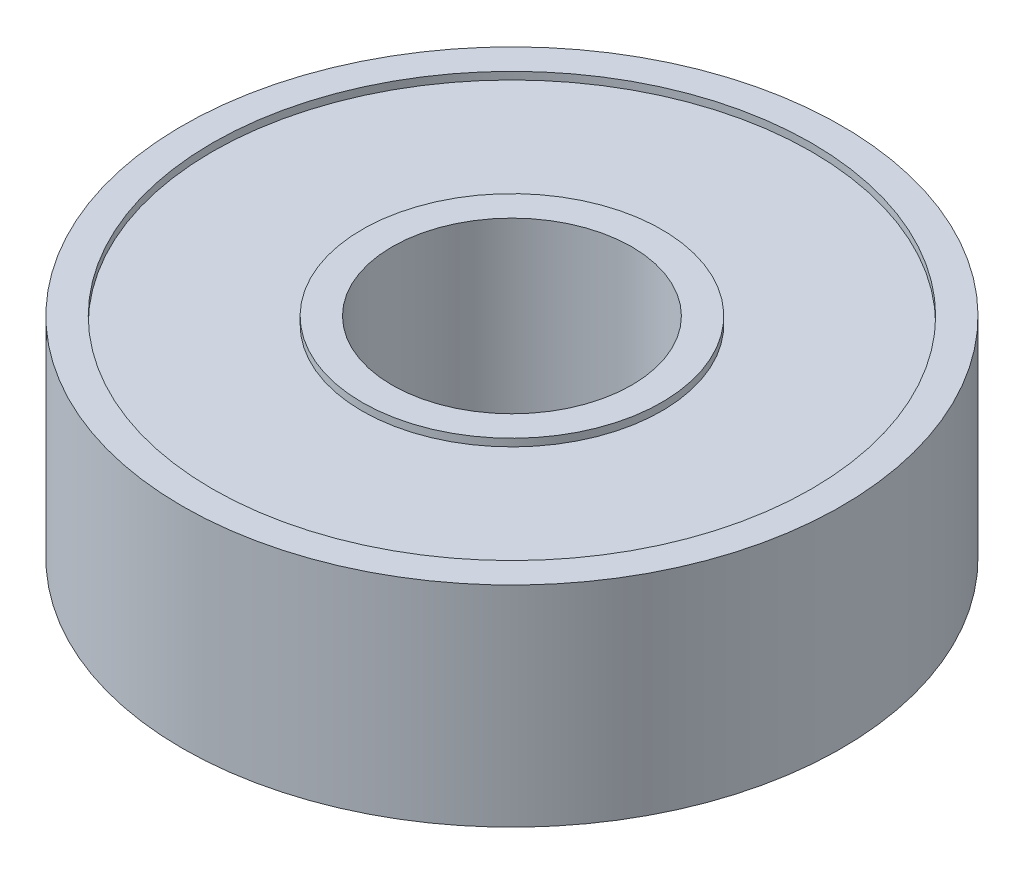
ISO-10303-21;
HEADER;
FILE_DESCRIPTION(('STEP AP214'),'2;1');
FILE_NAME('part.step','',(''),(''),'','','');
FILE_SCHEMA(('AUTOMOTIVE_DESIGN { 1 0 10303 214 1 1 1 1 }'));
ENDSEC;
DATA;
#1=APPLICATION_CONTEXT('core data for automotive mechanical design processes');
#2=APPLICATION_PROTOCOL_DEFINITION('international standard','automotive_design',2000,#1);
#3=PRODUCT_CONTEXT('',#1,'mechanical');
#4=PRODUCT('Part','Part','',(#3));
#5=PRODUCT_RELATED_PRODUCT_CATEGORY('part','',(#4));
#6=PRODUCT_DEFINITION_FORMATION('','',#4);
#7=PRODUCT_DEFINITION_CONTEXT('part definition',#1,'design');
#8=PRODUCT_DEFINITION('design','',#6,#7);
#9=PRODUCT_DEFINITION_SHAPE('','',#8);
#10=(LENGTH_UNIT() NAMED_UNIT(*) SI_UNIT(.MILLI.,.METRE.));
#11=(NAMED_UNIT(*) PLANE_ANGLE_UNIT() SI_UNIT($,.RADIAN.));
#12=(NAMED_UNIT(*) SI_UNIT($,.STERADIAN.) SOLID_ANGLE_UNIT());
#13=UNCERTAINTY_MEASURE_WITH_UNIT(LENGTH_MEASURE(1.E-05),#10,'distance_accuracy_value','');
#14=(GEOMETRIC_REPRESENTATION_CONTEXT(3) GLOBAL_UNCERTAINTY_ASSIGNED_CONTEXT((#13)) GLOBAL_UNIT_ASSIGNED_CONTEXT((#10,
#11,#12)) REPRESENTATION_CONTEXT('',''));
#15=CARTESIAN_POINT('',(0.,0.,0.));
#16=DIRECTION('',(0.,0.,1.));
#17=DIRECTION('',(1.,0.,0.));
#18=AXIS2_PLACEMENT_3D('',#15,#16,#17);
#19=CARTESIAN_POINT('',(0.,0.,0.));
#20=DIRECTION('',(0.,1.,0.));
#21=DIRECTION('',(0.,0.,1.));
#22=AXIS2_PLACEMENT_3D('',#19,#20,#21);
#23=PLANE('',#22);
#24=CARTESIAN_POINT('',(0.,0.,0.));
#25=DIRECTION('',(0.,1.,0.));
#26=DIRECTION('',(0.,0.,1.));
#27=AXIS2_PLACEMENT_3D('',#24,#25,#26);
#28=CIRCLE('',#27,10.);
#29=CARTESIAN_POINT('',(0.,0.,10.));
#30=VERTEX_POINT('',#29);
#31=EDGE_CURVE('E68',#30,#30,#28,.T.);
#32=ORIENTED_EDGE('',*,*,#31,.T.);
#33=EDGE_LOOP('',(#32));
#34=FACE_BOUND('',#33,.T.);
#35=CARTESIAN_POINT('',(0.,0.,0.));
#36=DIRECTION('',(0.,1.,0.));
#37=DIRECTION('',(0.,0.,1.));
#38=AXIS2_PLACEMENT_3D('',#35,#36,#37);
#39=CIRCLE('',#38,11.);
#40=CARTESIAN_POINT('',(0.,0.,11.));
#41=VERTEX_POINT('',#40);
#42=EDGE_CURVE('E33',#41,#41,#39,.T.);
#43=ORIENTED_EDGE('',*,*,#42,.F.);
#44=EDGE_LOOP('',(#43));
#45=FACE_BOUND('',#44,.T.);
#46=ADVANCED_FACE('F29',(#34,#45),#23,.F.);
#47=CARTESIAN_POINT('',(0.,7.,0.));
#48=DIRECTION('',(0.,1.,0.));
#49=DIRECTION('',(0.,0.,1.));
#50=AXIS2_PLACEMENT_3D('',#47,#48,#49);
#51=PLANE('',#50);
#52=CARTESIAN_POINT('',(0.,7.,0.));
#53=DIRECTION('',(0.,1.,0.));
#54=DIRECTION('',(0.,0.,1.));
#55=AXIS2_PLACEMENT_3D('',#52,#53,#54);
#56=CIRCLE('',#55,10.);
#57=CARTESIAN_POINT('',(0.,7.,10.));
#58=VERTEX_POINT('',#57);
#59=EDGE_CURVE('E56',#58,#58,#56,.T.);
#60=ORIENTED_EDGE('',*,*,#59,.F.);
#61=EDGE_LOOP('',(#60));
#62=FACE_BOUND('',#61,.T.);
#63=CARTESIAN_POINT('',(0.,7.,0.));
#64=DIRECTION('',(0.,1.,0.));
#65=DIRECTION('',(0.,0.,1.));
#66=AXIS2_PLACEMENT_3D('',#63,#64,#65);
#67=CIRCLE('',#66,11.);
#68=CARTESIAN_POINT('',(0.,7.,11.));
#69=VERTEX_POINT('',#68);
#70=EDGE_CURVE('E10',#69,#69,#67,.T.);
#71=ORIENTED_EDGE('',*,*,#70,.T.);
#72=EDGE_LOOP('',(#71));
#73=FACE_BOUND('',#72,.T.);
#74=ADVANCED_FACE('F114',(#62,#73),#51,.T.);
#75=CARTESIAN_POINT('',(0.,7.,0.));
#76=DIRECTION('',(0.,1.,0.));
#77=DIRECTION('',(0.,0.,1.));
#78=AXIS2_PLACEMENT_3D('',#75,#76,#77);
#79=CIRCLE('',#78,5.);
#80=CARTESIAN_POINT('',(0.,7.,5.));
#81=VERTEX_POINT('',#80);
#82=EDGE_CURVE('E53',#81,#81,#79,.T.);
#83=ORIENTED_EDGE('',*,*,#82,.T.);
#84=EDGE_LOOP('',(#83));
#85=FACE_BOUND('',#84,.T.);
#86=CARTESIAN_POINT('',(0.,7.,0.));
#87=DIRECTION('',(0.,1.,0.));
#88=DIRECTION('',(0.,0.,1.));
#89=AXIS2_PLACEMENT_3D('',#86,#87,#88);
#90=CIRCLE('',#89,4.);
#91=CARTESIAN_POINT('',(0.,7.,4.));
#92=VERTEX_POINT('',#91);
#93=EDGE_CURVE('E40',#92,#92,#90,.T.);
#94=ORIENTED_EDGE('',*,*,#93,.F.);
#95=EDGE_LOOP('',(#94));
#96=FACE_BOUND('',#95,.T.);
#97=ADVANCED_FACE('F96',(#85,#96),#51,.T.);
#98=CARTESIAN_POINT('',(0.,0.,0.));
#99=DIRECTION('',(0.,1.,0.));
#100=DIRECTION('',(0.,0.,1.));
#101=AXIS2_PLACEMENT_3D('',#98,#99,#100);
#102=CIRCLE('',#101,5.);
#103=CARTESIAN_POINT('',(0.,0.,5.));
#104=VERTEX_POINT('',#103);
#105=EDGE_CURVE('E65',#104,#104,#102,.T.);
#106=ORIENTED_EDGE('',*,*,#105,.F.);
#107=EDGE_LOOP('',(#106));
#108=FACE_BOUND('',#107,.T.);
#109=CARTESIAN_POINT('',(0.,0.,0.));
#110=DIRECTION('',(0.,1.,0.));
#111=DIRECTION('',(0.,0.,1.));
#112=AXIS2_PLACEMENT_3D('',#109,#110,#111);
#113=CIRCLE('',#112,4.);
#114=CARTESIAN_POINT('',(0.,0.,4.));
#115=VERTEX_POINT('',#114);
#116=EDGE_CURVE('E42',#115,#115,#113,.T.);
#117=ORIENTED_EDGE('',*,*,#116,.T.);
#118=EDGE_LOOP('',(#117));
#119=FACE_BOUND('',#118,.T.);
#120=ADVANCED_FACE('F93',(#108,#119),#23,.F.);
#121=CARTESIAN_POINT('',(0.,7.,0.));
#122=DIRECTION('',(0.,-1.,0.));
#123=DIRECTION('',(0.,0.,-1.));
#124=AXIS2_PLACEMENT_3D('',#121,#122,#123);
#125=CYLINDRICAL_SURFACE('',#124,11.);
#126=ORIENTED_EDGE('',*,*,#70,.F.);
#127=EDGE_LOOP('',(#126));
#128=FACE_BOUND('',#127,.T.);
#129=ORIENTED_EDGE('',*,*,#42,.T.);
#130=EDGE_LOOP('',(#129));
#131=FACE_BOUND('',#130,.T.);
#132=ADVANCED_FACE('F31',(#128,#131),#125,.T.);
#133=CARTESIAN_POINT('',(0.,7.,0.));
#134=DIRECTION('',(0.,-1.,0.));
#135=DIRECTION('',(0.,0.,-1.));
#136=AXIS2_PLACEMENT_3D('',#133,#134,#135);
#137=CYLINDRICAL_SURFACE('',#136,4.);
#138=ORIENTED_EDGE('',*,*,#93,.T.);
#139=EDGE_LOOP('',(#138));
#140=FACE_BOUND('',#139,.T.);
#141=ORIENTED_EDGE('',*,*,#116,.F.);
#142=EDGE_LOOP('',(#141));
#143=FACE_BOUND('',#142,.T.);
#144=ADVANCED_FACE('F99',(#140,#143),#137,.F.);
#145=CARTESIAN_POINT('',(0.,7.,0.));
#146=DIRECTION('',(0.,1.,0.));
#147=DIRECTION('',(0.,0.,1.));
#148=AXIS2_PLACEMENT_3D('',#145,#146,#147);
#149=CYLINDRICAL_SURFACE('',#148,10.);
#150=CARTESIAN_POINT('',(0.,6.75,0.));
#151=DIRECTION('',(0.,1.,0.));
#152=DIRECTION('',(0.,0.,1.));
#153=AXIS2_PLACEMENT_3D('',#150,#151,#152);
#154=CIRCLE('',#153,10.);
#155=CARTESIAN_POINT('',(0.,6.75,10.));
#156=VERTEX_POINT('',#155);
#157=EDGE_CURVE('E45',#156,#156,#154,.T.);
#158=ORIENTED_EDGE('',*,*,#157,.F.);
#159=EDGE_LOOP('',(#158));
#160=FACE_BOUND('',#159,.T.);
#161=ORIENTED_EDGE('',*,*,#59,.T.);
#162=EDGE_LOOP('',(#161));
#163=FACE_BOUND('',#162,.T.);
#164=ADVANCED_FACE('F101',(#160,#163),#149,.F.);
#165=CARTESIAN_POINT('',(-10.,6.75,0.));
#166=DIRECTION('',(0.,-1.,0.));
#167=DIRECTION('',(0.,0.,-1.));
#168=AXIS2_PLACEMENT_3D('',#165,#166,#167);
#169=PLANE('',#168);
#170=CARTESIAN_POINT('',(0.,6.75,0.));
#171=DIRECTION('',(0.,1.,0.));
#172=DIRECTION('',(0.,0.,1.));
#173=AXIS2_PLACEMENT_3D('',#170,#171,#172);
#174=CIRCLE('',#173,5.);
#175=CARTESIAN_POINT('',(0.,6.75,5.));
#176=VERTEX_POINT('',#175);
#177=EDGE_CURVE('E50',#176,#176,#174,.T.);
#178=ORIENTED_EDGE('',*,*,#177,.F.);
#179=EDGE_LOOP('',(#178));
#180=FACE_BOUND('',#179,.T.);
#181=ORIENTED_EDGE('',*,*,#157,.T.);
#182=EDGE_LOOP('',(#181));
#183=FACE_BOUND('',#182,.T.);
#184=ADVANCED_FACE('F108',(#180,#183),#169,.F.);
#185=CARTESIAN_POINT('',(0.,7.,0.));
#186=DIRECTION('',(0.,1.,0.));
#187=DIRECTION('',(0.,0.,1.));
#188=AXIS2_PLACEMENT_3D('',#185,#186,#187);
#189=CYLINDRICAL_SURFACE('',#188,5.);
#190=ORIENTED_EDGE('',*,*,#82,.F.);
#191=EDGE_LOOP('',(#190));
#192=FACE_BOUND('',#191,.T.);
#193=ORIENTED_EDGE('',*,*,#177,.T.);
#194=EDGE_LOOP('',(#193));
#195=FACE_BOUND('',#194,.T.);
#196=ADVANCED_FACE('F78',(#192,#195),#189,.T.);
#197=CARTESIAN_POINT('',(0.,7.,0.));
#198=DIRECTION('',(0.,1.,0.));
#199=DIRECTION('',(0.,0.,1.));
#200=AXIS2_PLACEMENT_3D('',#197,#198,#199);
#201=CYLINDRICAL_SURFACE('',#200,10.);
#202=ORIENTED_EDGE('',*,*,#31,.F.);
#203=EDGE_LOOP('',(#202));
#204=FACE_BOUND('',#203,.T.);
#205=CARTESIAN_POINT('',(0.,0.25,0.));
#206=DIRECTION('',(0.,1.,0.));
#207=DIRECTION('',(0.,0.,1.));
#208=AXIS2_PLACEMENT_3D('',#205,#206,#207);
#209=CIRCLE('',#208,10.);
#210=CARTESIAN_POINT('',(0.,0.25,10.));
#211=VERTEX_POINT('',#210);
#212=EDGE_CURVE('E59',#211,#211,#209,.T.);
#213=ORIENTED_EDGE('',*,*,#212,.T.);
#214=EDGE_LOOP('',(#213));
#215=FACE_BOUND('',#214,.T.);
#216=ADVANCED_FACE('F74',(#204,#215),#201,.F.);
#217=CARTESIAN_POINT('',(-10.,0.25,0.));
#218=DIRECTION('',(0.,1.,0.));
#219=DIRECTION('',(0.,0.,1.));
#220=AXIS2_PLACEMENT_3D('',#217,#218,#219);
#221=PLANE('',#220);
#222=ORIENTED_EDGE('',*,*,#212,.F.);
#223=EDGE_LOOP('',(#222));
#224=FACE_BOUND('',#223,.T.);
#225=CARTESIAN_POINT('',(0.,0.25,0.));
#226=DIRECTION('',(0.,1.,0.));
#227=DIRECTION('',(0.,0.,1.));
#228=AXIS2_PLACEMENT_3D('',#225,#226,#227);
#229=CIRCLE('',#228,5.);
#230=CARTESIAN_POINT('',(0.,0.25,5.));
#231=VERTEX_POINT('',#230);
#232=EDGE_CURVE('E62',#231,#231,#229,.T.);
#233=ORIENTED_EDGE('',*,*,#232,.T.);
#234=EDGE_LOOP('',(#233));
#235=FACE_BOUND('',#234,.T.);
#236=ADVANCED_FACE('F77',(#224,#235),#221,.F.);
#237=CARTESIAN_POINT('',(0.,7.,0.));
#238=DIRECTION('',(0.,1.,0.));
#239=DIRECTION('',(0.,0.,1.));
#240=AXIS2_PLACEMENT_3D('',#237,#238,#239);
#241=CYLINDRICAL_SURFACE('',#240,5.);
#242=ORIENTED_EDGE('',*,*,#232,.F.);
#243=EDGE_LOOP('',(#242));
#244=FACE_BOUND('',#243,.T.);
#245=ORIENTED_EDGE('',*,*,#105,.T.);
#246=EDGE_LOOP('',(#245));
#247=FACE_BOUND('',#246,.T.);
#248=ADVANCED_FACE('F84',(#244,#247),#241,.T.);
#249=CLOSED_SHELL('',(#46,#74,#97,#120,#132,#144,#164,#184,#196,#216,#236,#248));
#250=MANIFOLD_SOLID_BREP('B2',#249);
#251=ADVANCED_BREP_SHAPE_REPRESENTATION('',(#18,#250),#14);
#252=SHAPE_DEFINITION_REPRESENTATION(#9,#251);
ENDSEC;
END-ISO-10303-21;
